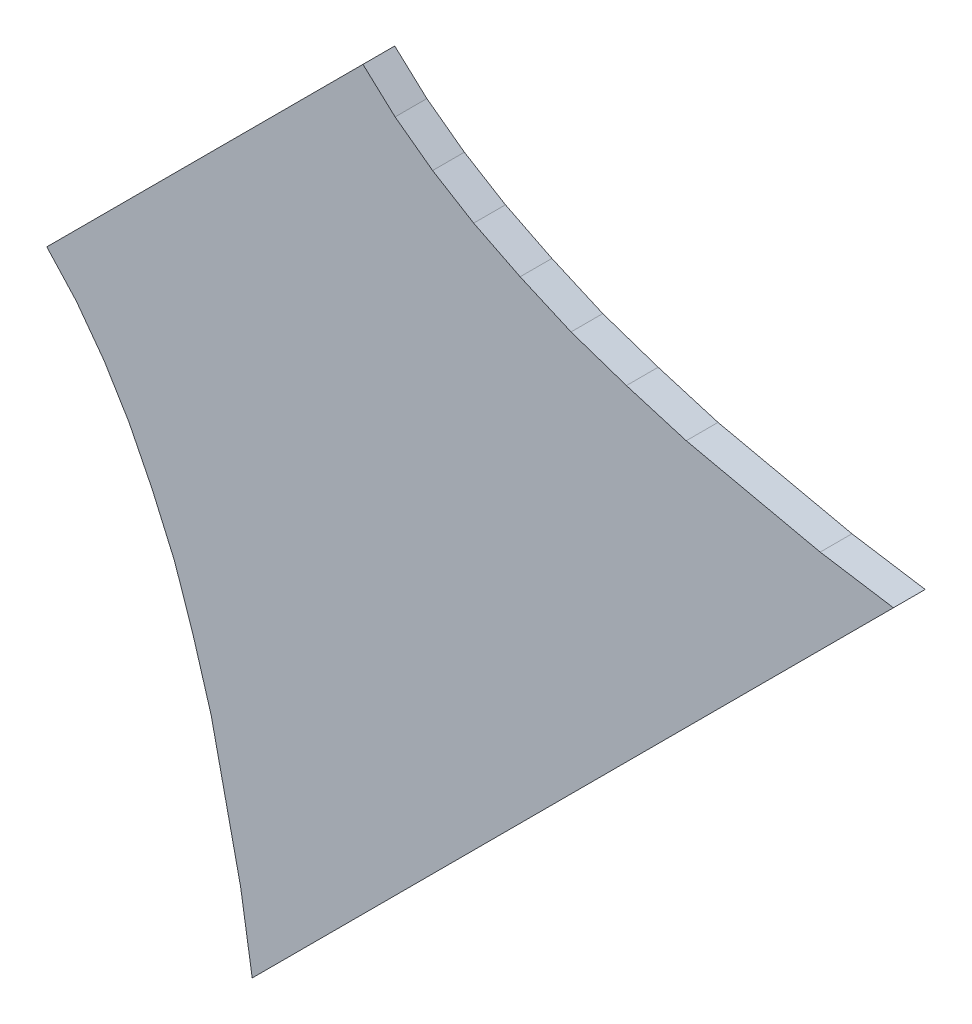
ISO-10303-21;
HEADER;
FILE_DESCRIPTION(('STEP AP214'),'2;1');
FILE_NAME('part.step','',(''),(''),'','','');
FILE_SCHEMA(('AUTOMOTIVE_DESIGN { 1 0 10303 214 1 1 1 1 }'));
ENDSEC;
DATA;
#1=APPLICATION_CONTEXT('core data for automotive mechanical design processes');
#2=APPLICATION_PROTOCOL_DEFINITION('international standard','automotive_design',2000,#1);
#3=PRODUCT_CONTEXT('',#1,'mechanical');
#4=PRODUCT('Part','Part','',(#3));
#5=PRODUCT_RELATED_PRODUCT_CATEGORY('part','',(#4));
#6=PRODUCT_DEFINITION_FORMATION('','',#4);
#7=PRODUCT_DEFINITION_CONTEXT('part definition',#1,'design');
#8=PRODUCT_DEFINITION('design','',#6,#7);
#9=PRODUCT_DEFINITION_SHAPE('','',#8);
#10=(LENGTH_UNIT() NAMED_UNIT(*) SI_UNIT(.MILLI.,.METRE.));
#11=(NAMED_UNIT(*) PLANE_ANGLE_UNIT() SI_UNIT($,.RADIAN.));
#12=(NAMED_UNIT(*) SI_UNIT($,.STERADIAN.) SOLID_ANGLE_UNIT());
#13=UNCERTAINTY_MEASURE_WITH_UNIT(LENGTH_MEASURE(1.E-05),#10,'distance_accuracy_value','');
#14=(GEOMETRIC_REPRESENTATION_CONTEXT(3) GLOBAL_UNCERTAINTY_ASSIGNED_CONTEXT((#13)) GLOBAL_UNIT_ASSIGNED_CONTEXT((#10,
#11,#12)) REPRESENTATION_CONTEXT('',''));
#15=CARTESIAN_POINT('',(0.,0.,0.));
#16=DIRECTION('',(0.,0.,1.));
#17=DIRECTION('',(1.,0.,0.));
#18=AXIS2_PLACEMENT_3D('',#15,#16,#17);
#19=CARTESIAN_POINT('',(98.0410003662109,93.504997253418,0.));
#20=DIRECTION('',(0.737141169182066,0.675738778446892,0.));
#21=DIRECTION('',(0.675738778446892,-0.737141169182066,0.));
#22=AXIS2_PLACEMENT_3D('',#19,#20,#21);
#23=PLANE('',#22);
#24=DIRECTION('',(0.675738778446892,-0.737141169182066,0.));
#25=VECTOR('',#24,1.);
#26=CARTESIAN_POINT('',(98.0410003662109,93.504997253418,0.03556));
#27=LINE('',#26,#25);
#28=CARTESIAN_POINT('',(98.0410003662109,93.504997253418,0.03556));
#29=VERTEX_POINT('',#28);
#30=CARTESIAN_POINT('',(98.0739974975586,93.4690017700195,0.03556));
#31=VERTEX_POINT('',#30);
#32=EDGE_CURVE('E11',#29,#31,#27,.T.);
#33=ORIENTED_EDGE('',*,*,#32,.F.);
#34=DIRECTION('',(0.,0.,1.));
#35=VECTOR('',#34,1.);
#36=CARTESIAN_POINT('',(98.0410003662109,93.504997253418,0.));
#37=LINE('',#36,#35);
#38=CARTESIAN_POINT('',(98.0410003662109,93.504997253418,0.));
#39=VERTEX_POINT('',#38);
#40=EDGE_CURVE('E24',#39,#29,#37,.T.);
#41=ORIENTED_EDGE('',*,*,#40,.F.);
#42=DIRECTION('',(0.675738778446892,-0.737141169182066,0.));
#43=VECTOR('',#42,1.);
#44=CARTESIAN_POINT('',(98.0410003662109,93.504997253418,0.));
#45=LINE('',#44,#43);
#46=CARTESIAN_POINT('',(98.0739974975586,93.4690017700195,0.));
#47=VERTEX_POINT('',#46);
#48=EDGE_CURVE('E172',#39,#47,#45,.T.);
#49=ORIENTED_EDGE('',*,*,#48,.T.);
#50=DIRECTION('',(0.,0.,1.));
#51=VECTOR('',#50,1.);
#52=CARTESIAN_POINT('',(98.0739974975586,93.4690017700195,0.));
#53=LINE('',#52,#51);
#54=EDGE_CURVE('E37',#47,#31,#53,.T.);
#55=ORIENTED_EDGE('',*,*,#54,.T.);
#56=EDGE_LOOP('',(#33,#41,#49,#55));
#57=FACE_BOUND('',#56,.T.);
#58=ADVANCED_FACE('F17',(#57),#23,.F.);
#59=CARTESIAN_POINT('',(98.0739974975586,93.4690017700195,0.));
#60=DIRECTION('',(0.804519212056665,0.59392662630305,0.));
#61=DIRECTION('',(0.59392662630305,-0.804519212056665,0.));
#62=AXIS2_PLACEMENT_3D('',#59,#60,#61);
#63=PLANE('',#62);
#64=DIRECTION('',(0.59392662630305,-0.804519212056665,0.));
#65=VECTOR('',#64,1.);
#66=CARTESIAN_POINT('',(98.0739974975586,93.4690017700195,0.03556));
#67=LINE('',#66,#65);
#68=CARTESIAN_POINT('',(98.1050033569336,93.427001953125,0.03556));
#69=VERTEX_POINT('',#68);
#70=EDGE_CURVE('E308',#31,#69,#67,.T.);
#71=ORIENTED_EDGE('',*,*,#70,.F.);
#72=ORIENTED_EDGE('',*,*,#54,.F.);
#73=DIRECTION('',(0.59392662630305,-0.804519212056665,0.));
#74=VECTOR('',#73,1.);
#75=CARTESIAN_POINT('',(98.0739974975586,93.4690017700195,0.));
#76=LINE('',#75,#74);
#77=CARTESIAN_POINT('',(98.1050033569336,93.427001953125,0.));
#78=VERTEX_POINT('',#77);
#79=EDGE_CURVE('E305',#47,#78,#76,.T.);
#80=ORIENTED_EDGE('',*,*,#79,.T.);
#81=DIRECTION('',(0.,0.,1.));
#82=VECTOR('',#81,1.);
#83=CARTESIAN_POINT('',(98.1050033569336,93.427001953125,0.));
#84=LINE('',#83,#82);
#85=EDGE_CURVE('E303',#78,#69,#84,.T.);
#86=ORIENTED_EDGE('',*,*,#85,.T.);
#87=EDGE_LOOP('',(#71,#72,#80,#86));
#88=FACE_BOUND('',#87,.T.);
#89=ADVANCED_FACE('F316',(#88),#63,.F.);
#90=CARTESIAN_POINT('',(98.1050033569336,93.427001953125,0.));
#91=DIRECTION('',(0.854225909982595,0.51990200491478,0.));
#92=DIRECTION('',(0.51990200491478,-0.854225909982595,0.));
#93=AXIS2_PLACEMENT_3D('',#90,#91,#92);
#94=PLANE('',#93);
#95=DIRECTION('',(0.51990200491478,-0.854225909982595,0.));
#96=VECTOR('',#95,1.);
#97=CARTESIAN_POINT('',(98.1050033569336,93.427001953125,0.03556));
#98=LINE('',#97,#96);
#99=CARTESIAN_POINT('',(98.1330032348633,93.3809967041016,0.03556));
#100=VERTEX_POINT('',#99);
#101=EDGE_CURVE('E300',#69,#100,#98,.T.);
#102=ORIENTED_EDGE('',*,*,#101,.F.);
#103=ORIENTED_EDGE('',*,*,#85,.F.);
#104=DIRECTION('',(0.51990200491478,-0.854225909982595,0.));
#105=VECTOR('',#104,1.);
#106=CARTESIAN_POINT('',(98.1050033569336,93.427001953125,0.));
#107=LINE('',#106,#105);
#108=CARTESIAN_POINT('',(98.1330032348633,93.3809967041016,0.));
#109=VERTEX_POINT('',#108);
#110=EDGE_CURVE('E297',#78,#109,#107,.T.);
#111=ORIENTED_EDGE('',*,*,#110,.T.);
#112=DIRECTION('',(0.,0.,1.));
#113=VECTOR('',#112,1.);
#114=CARTESIAN_POINT('',(98.1330032348633,93.3809967041016,0.));
#115=LINE('',#114,#113);
#116=EDGE_CURVE('E295',#109,#100,#115,.T.);
#117=ORIENTED_EDGE('',*,*,#116,.T.);
#118=EDGE_LOOP('',(#102,#103,#111,#117));
#119=FACE_BOUND('',#118,.T.);
#120=ADVANCED_FACE('F322',(#119),#94,.F.);
#121=CARTESIAN_POINT('',(98.1330032348633,93.3809967041016,0.));
#122=DIRECTION('',(0.894453439009846,0.447161095628253,0.));
#123=DIRECTION('',(0.447161095628253,-0.894453439009846,0.));
#124=AXIS2_PLACEMENT_3D('',#121,#122,#123);
#125=PLANE('',#124);
#126=DIRECTION('',(0.447161095628253,-0.894453439009846,0.));
#127=VECTOR('',#126,1.);
#128=CARTESIAN_POINT('',(98.1330032348633,93.3809967041016,0.03556));
#129=LINE('',#128,#127);
#130=CARTESIAN_POINT('',(98.1589965820312,93.3290023803711,0.03556));
#131=VERTEX_POINT('',#130);
#132=EDGE_CURVE('E292',#100,#131,#129,.T.);
#133=ORIENTED_EDGE('',*,*,#132,.F.);
#134=ORIENTED_EDGE('',*,*,#116,.F.);
#135=DIRECTION('',(0.447161095628253,-0.894453439009846,0.));
#136=VECTOR('',#135,1.);
#137=CARTESIAN_POINT('',(98.1330032348633,93.3809967041016,0.));
#138=LINE('',#137,#136);
#139=CARTESIAN_POINT('',(98.1589965820312,93.3290023803711,0.));
#140=VERTEX_POINT('',#139);
#141=EDGE_CURVE('E289',#109,#140,#138,.T.);
#142=ORIENTED_EDGE('',*,*,#141,.T.);
#143=DIRECTION('',(0.,0.,1.));
#144=VECTOR('',#143,1.);
#145=CARTESIAN_POINT('',(98.1589965820312,93.3290023803711,0.));
#146=LINE('',#145,#144);
#147=EDGE_CURVE('E287',#140,#131,#146,.T.);
#148=ORIENTED_EDGE('',*,*,#147,.T.);
#149=EDGE_LOOP('',(#133,#134,#142,#148));
#150=FACE_BOUND('',#149,.T.);
#151=ADVANCED_FACE('F324',(#150),#125,.F.);
#152=CARTESIAN_POINT('',(98.1589965820312,93.3290023803711,0.));
#153=DIRECTION('',(0.915777134064196,0.401686744522604,0.));
#154=DIRECTION('',(0.401686744522604,-0.915777134064196,0.));
#155=AXIS2_PLACEMENT_3D('',#152,#153,#154);
#156=PLANE('',#155);
#157=DIRECTION('',(0.401686744522604,-0.915777134064196,0.));
#158=VECTOR('',#157,1.);
#159=CARTESIAN_POINT('',(98.1589965820312,93.3290023803711,0.03556));
#160=LINE('',#159,#158);
#161=CARTESIAN_POINT('',(98.1839981079102,93.2720031738281,0.03556));
#162=VERTEX_POINT('',#161);
#163=EDGE_CURVE('E284',#131,#162,#160,.T.);
#164=ORIENTED_EDGE('',*,*,#163,.F.);
#165=ORIENTED_EDGE('',*,*,#147,.F.);
#166=DIRECTION('',(0.401686744522604,-0.915777134064196,0.));
#167=VECTOR('',#166,1.);
#168=CARTESIAN_POINT('',(98.1589965820312,93.3290023803711,0.));
#169=LINE('',#168,#167);
#170=CARTESIAN_POINT('',(98.1839981079102,93.2720031738281,0.));
#171=VERTEX_POINT('',#170);
#172=EDGE_CURVE('E281',#140,#171,#169,.T.);
#173=ORIENTED_EDGE('',*,*,#172,.T.);
#174=DIRECTION('',(0.,0.,1.));
#175=VECTOR('',#174,1.);
#176=CARTESIAN_POINT('',(98.1839981079102,93.2720031738281,0.));
#177=LINE('',#176,#175);
#178=EDGE_CURVE('E279',#171,#162,#177,.T.);
#179=ORIENTED_EDGE('',*,*,#178,.T.);
#180=EDGE_LOOP('',(#164,#165,#173,#179));
#181=FACE_BOUND('',#180,.T.);
#182=ADVANCED_FACE('F329',(#181),#156,.F.);
#183=CARTESIAN_POINT('',(98.1839981079102,93.2720031738281,0.));
#184=DIRECTION('',(0.947133723252728,0.320839072242495,0.));
#185=DIRECTION('',(0.320839072242495,-0.947133723252728,0.));
#186=AXIS2_PLACEMENT_3D('',#183,#184,#185);
#187=PLANE('',#186);
#188=DIRECTION('',(0.320839072242495,-0.947133723252728,0.));
#189=VECTOR('',#188,1.);
#190=CARTESIAN_POINT('',(98.1839981079102,93.2720031738281,0.03556));
#191=LINE('',#190,#189);
#192=CARTESIAN_POINT('',(98.2050018310547,93.2099990844727,0.03556));
#193=VERTEX_POINT('',#192);
#194=EDGE_CURVE('E276',#162,#193,#191,.T.);
#195=ORIENTED_EDGE('',*,*,#194,.F.);
#196=ORIENTED_EDGE('',*,*,#178,.F.);
#197=DIRECTION('',(0.320839072242495,-0.947133723252728,0.));
#198=VECTOR('',#197,1.);
#199=CARTESIAN_POINT('',(98.1839981079102,93.2720031738281,0.));
#200=LINE('',#199,#198);
#201=CARTESIAN_POINT('',(98.2050018310547,93.2099990844727,0.));
#202=VERTEX_POINT('',#201);
#203=EDGE_CURVE('E273',#171,#202,#200,.T.);
#204=ORIENTED_EDGE('',*,*,#203,.T.);
#205=DIRECTION('',(0.,0.,1.));
#206=VECTOR('',#205,1.);
#207=CARTESIAN_POINT('',(98.2050018310547,93.2099990844727,0.));
#208=LINE('',#207,#206);
#209=EDGE_CURVE('E271',#202,#193,#208,.T.);
#210=ORIENTED_EDGE('',*,*,#209,.T.);
#211=EDGE_LOOP('',(#195,#196,#204,#210));
#212=FACE_BOUND('',#211,.T.);
#213=ADVANCED_FACE('F332',(#212),#187,.F.);
#214=CARTESIAN_POINT('',(98.2050018310547,93.2099990844727,0.));
#215=DIRECTION('',(0.958233742102819,0.285986180602538,0.));
#216=DIRECTION('',(0.285986180602538,-0.958233742102819,0.));
#217=AXIS2_PLACEMENT_3D('',#214,#215,#216);
#218=PLANE('',#217);
#219=DIRECTION('',(0.285986180602538,-0.958233742102819,0.));
#220=VECTOR('',#219,1.);
#221=CARTESIAN_POINT('',(98.2050018310547,93.2099990844727,0.03556));
#222=LINE('',#221,#220);
#223=CARTESIAN_POINT('',(98.2249984741211,93.1429977416992,0.03556));
#224=VERTEX_POINT('',#223);
#225=EDGE_CURVE('E268',#193,#224,#222,.T.);
#226=ORIENTED_EDGE('',*,*,#225,.F.);
#227=ORIENTED_EDGE('',*,*,#209,.F.);
#228=DIRECTION('',(0.285986180602538,-0.958233742102819,0.));
#229=VECTOR('',#228,1.);
#230=CARTESIAN_POINT('',(98.2050018310547,93.2099990844727,0.));
#231=LINE('',#230,#229);
#232=CARTESIAN_POINT('',(98.2249984741211,93.1429977416992,0.));
#233=VERTEX_POINT('',#232);
#234=EDGE_CURVE('E265',#202,#233,#231,.T.);
#235=ORIENTED_EDGE('',*,*,#234,.T.);
#236=DIRECTION('',(0.,0.,1.));
#237=VECTOR('',#236,1.);
#238=CARTESIAN_POINT('',(98.2249984741211,93.1429977416992,0.));
#239=LINE('',#238,#237);
#240=EDGE_CURVE('E263',#233,#224,#239,.T.);
#241=ORIENTED_EDGE('',*,*,#240,.T.);
#242=EDGE_LOOP('',(#226,#227,#235,#241));
#243=FACE_BOUND('',#242,.T.);
#244=ADVANCED_FACE('F337',(#243),#218,.F.);
#245=CARTESIAN_POINT('',(98.2249984741211,93.1429977416992,0.));
#246=DIRECTION('',(0.976638420545082,0.214889263378161,0.));
#247=DIRECTION('',(0.214889263378161,-0.976638420545082,0.));
#248=AXIS2_PLACEMENT_3D('',#245,#246,#247);
#249=PLANE('',#248);
#250=DIRECTION('',(0.214889263378161,-0.976638420545081,0.));
#251=VECTOR('',#250,1.);
#252=CARTESIAN_POINT('',(98.2249984741211,93.1429977416992,0.03556));
#253=LINE('',#252,#251);
#254=CARTESIAN_POINT('',(98.2580032348633,92.9929962158203,0.03556));
#255=VERTEX_POINT('',#254);
#256=EDGE_CURVE('E260',#224,#255,#253,.T.);
#257=ORIENTED_EDGE('',*,*,#256,.F.);
#258=ORIENTED_EDGE('',*,*,#240,.F.);
#259=DIRECTION('',(0.214889263378161,-0.976638420545081,0.));
#260=VECTOR('',#259,1.);
#261=CARTESIAN_POINT('',(98.2249984741211,93.1429977416992,0.));
#262=LINE('',#261,#260);
#263=CARTESIAN_POINT('',(98.2580032348633,92.9929962158203,0.));
#264=VERTEX_POINT('',#263);
#265=EDGE_CURVE('E257',#233,#264,#262,.T.);
#266=ORIENTED_EDGE('',*,*,#265,.T.);
#267=DIRECTION('',(0.,0.,1.));
#268=VECTOR('',#267,1.);
#269=CARTESIAN_POINT('',(98.2580032348633,92.9929962158203,0.));
#270=LINE('',#269,#268);
#271=EDGE_CURVE('E255',#264,#255,#270,.T.);
#272=ORIENTED_EDGE('',*,*,#271,.T.);
#273=EDGE_LOOP('',(#257,#258,#266,#272));
#274=FACE_BOUND('',#273,.T.);
#275=ADVANCED_FACE('F340',(#274),#249,.F.);
#276=CARTESIAN_POINT('',(98.2580032348633,92.9929962158203,0.));
#277=DIRECTION('',(0.98766216531375,0.156599639871092,0.));
#278=DIRECTION('',(0.156599639871092,-0.98766216531375,0.));
#279=AXIS2_PLACEMENT_3D('',#276,#277,#278);
#280=PLANE('',#279);
#281=DIRECTION('',(0.156599639871092,-0.98766216531375,0.));
#282=VECTOR('',#281,1.);
#283=CARTESIAN_POINT('',(98.2580032348633,92.9929962158203,0.03556));
#284=LINE('',#283,#282);
#285=CARTESIAN_POINT('',(98.2710037231445,92.911003112793,0.03556));
#286=VERTEX_POINT('',#285);
#287=EDGE_CURVE('E252',#255,#286,#284,.T.);
#288=ORIENTED_EDGE('',*,*,#287,.F.);
#289=ORIENTED_EDGE('',*,*,#271,.F.);
#290=DIRECTION('',(0.156599639871092,-0.98766216531375,0.));
#291=VECTOR('',#290,1.);
#292=CARTESIAN_POINT('',(98.2580032348633,92.9929962158203,0.));
#293=LINE('',#292,#291);
#294=CARTESIAN_POINT('',(98.2710037231445,92.911003112793,0.));
#295=VERTEX_POINT('',#294);
#296=EDGE_CURVE('E249',#264,#295,#293,.T.);
#297=ORIENTED_EDGE('',*,*,#296,.T.);
#298=DIRECTION('',(0.,0.,1.));
#299=VECTOR('',#298,1.);
#300=CARTESIAN_POINT('',(98.2710037231445,92.911003112793,0.));
#301=LINE('',#300,#299);
#302=EDGE_CURVE('E247',#295,#286,#301,.T.);
#303=ORIENTED_EDGE('',*,*,#302,.T.);
#304=EDGE_LOOP('',(#288,#289,#297,#303));
#305=FACE_BOUND('',#304,.T.);
#306=ADVANCED_FACE('F345',(#305),#280,.F.);
#307=CARTESIAN_POINT('',(98.2710037231445,92.911003112793,0.));
#308=DIRECTION('',(-0.707106781186548,0.707106781186548,0.));
#309=DIRECTION('',(0.707106781186548,0.707106781186548,0.));
#310=AXIS2_PLACEMENT_3D('',#307,#308,#309);
#311=PLANE('',#310);
#312=DIRECTION('',(0.707106781186548,0.707106781186548,0.));
#313=VECTOR('',#312,1.);
#314=CARTESIAN_POINT('',(98.2710037231445,92.911003112793,0.03556));
#315=LINE('',#314,#313);
#316=CARTESIAN_POINT('',(98.9889984130859,93.6289978027344,0.03556));
#317=VERTEX_POINT('',#316);
#318=EDGE_CURVE('E244',#286,#317,#315,.T.);
#319=ORIENTED_EDGE('',*,*,#318,.F.);
#320=ORIENTED_EDGE('',*,*,#302,.F.);
#321=DIRECTION('',(0.707106781186548,0.707106781186548,0.));
#322=VECTOR('',#321,1.);
#323=CARTESIAN_POINT('',(98.2710037231445,92.911003112793,0.));
#324=LINE('',#323,#322);
#325=CARTESIAN_POINT('',(98.9889984130859,93.6289978027344,0.));
#326=VERTEX_POINT('',#325);
#327=EDGE_CURVE('E241',#295,#326,#324,.T.);
#328=ORIENTED_EDGE('',*,*,#327,.T.);
#329=DIRECTION('',(0.,0.,1.));
#330=VECTOR('',#329,1.);
#331=CARTESIAN_POINT('',(98.9889984130859,93.6289978027344,0.));
#332=LINE('',#331,#330);
#333=EDGE_CURVE('E239',#326,#317,#332,.T.);
#334=ORIENTED_EDGE('',*,*,#333,.T.);
#335=EDGE_LOOP('',(#319,#320,#328,#334));
#336=FACE_BOUND('',#335,.T.);
#337=ADVANCED_FACE('F348',(#336),#311,.F.);
#338=CARTESIAN_POINT('',(98.9889984130859,93.6289978027344,0.));
#339=DIRECTION('',(-0.156585427012916,-0.987664418741094,0.));
#340=DIRECTION('',(-0.987664418741094,0.156585427012916,0.));
#341=AXIS2_PLACEMENT_3D('',#338,#339,#340);
#342=PLANE('',#341);
#343=DIRECTION('',(-0.987664418741094,0.156585427012916,0.));
#344=VECTOR('',#343,1.);
#345=CARTESIAN_POINT('',(98.9889984130859,93.6289978027344,0.03556));
#346=LINE('',#345,#344);
#347=CARTESIAN_POINT('',(98.9069976806641,93.6419982910156,0.03556));
#348=VERTEX_POINT('',#347);
#349=EDGE_CURVE('E236',#317,#348,#346,.T.);
#350=ORIENTED_EDGE('',*,*,#349,.F.);
#351=ORIENTED_EDGE('',*,*,#333,.F.);
#352=DIRECTION('',(-0.987664418741094,0.156585427012916,0.));
#353=VECTOR('',#352,1.);
#354=CARTESIAN_POINT('',(98.9889984130859,93.6289978027344,0.));
#355=LINE('',#354,#353);
#356=CARTESIAN_POINT('',(98.9069976806641,93.6419982910156,0.));
#357=VERTEX_POINT('',#356);
#358=EDGE_CURVE('E233',#326,#357,#355,.T.);
#359=ORIENTED_EDGE('',*,*,#358,.T.);
#360=DIRECTION('',(0.,0.,1.));
#361=VECTOR('',#360,1.);
#362=CARTESIAN_POINT('',(98.9069976806641,93.6419982910156,0.));
#363=LINE('',#362,#361);
#364=EDGE_CURVE('E231',#357,#348,#363,.T.);
#365=ORIENTED_EDGE('',*,*,#364,.T.);
#366=EDGE_LOOP('',(#350,#351,#359,#365));
#367=FACE_BOUND('',#366,.T.);
#368=ADVANCED_FACE('F353',(#367),#342,.F.);
#369=CARTESIAN_POINT('',(98.9069976806641,93.6419982910156,0.));
#370=DIRECTION('',(-0.214899688887557,-0.976636126567122,0.));
#371=DIRECTION('',(-0.976636126567122,0.214899688887557,0.));
#372=AXIS2_PLACEMENT_3D('',#369,#370,#371);
#373=PLANE('',#372);
#374=DIRECTION('',(-0.976636126567122,0.214899688887557,0.));
#375=VECTOR('',#374,1.);
#376=CARTESIAN_POINT('',(98.9069976806641,93.6419982910156,0.03556));
#377=LINE('',#376,#375);
#378=CARTESIAN_POINT('',(98.7570037841797,93.6750030517578,0.03556));
#379=VERTEX_POINT('',#378);
#380=EDGE_CURVE('E228',#348,#379,#377,.T.);
#381=ORIENTED_EDGE('',*,*,#380,.F.);
#382=ORIENTED_EDGE('',*,*,#364,.F.);
#383=DIRECTION('',(-0.976636126567122,0.214899688887557,0.));
#384=VECTOR('',#383,1.);
#385=CARTESIAN_POINT('',(98.9069976806641,93.6419982910156,0.));
#386=LINE('',#385,#384);
#387=CARTESIAN_POINT('',(98.7570037841797,93.6750030517578,0.));
#388=VERTEX_POINT('',#387);
#389=EDGE_CURVE('E225',#357,#388,#386,.T.);
#390=ORIENTED_EDGE('',*,*,#389,.T.);
#391=DIRECTION('',(0.,0.,1.));
#392=VECTOR('',#391,1.);
#393=CARTESIAN_POINT('',(98.7570037841797,93.6750030517578,0.));
#394=LINE('',#393,#392);
#395=EDGE_CURVE('E223',#388,#379,#394,.T.);
#396=ORIENTED_EDGE('',*,*,#395,.T.);
#397=EDGE_LOOP('',(#381,#382,#390,#396));
#398=FACE_BOUND('',#397,.T.);
#399=ADVANCED_FACE('F356',(#398),#373,.F.);
#400=CARTESIAN_POINT('',(98.7570037841797,93.6750030517578,0.));
#401=DIRECTION('',(-0.285986180602538,-0.958233742102819,0.));
#402=DIRECTION('',(-0.958233742102819,0.285986180602538,0.));
#403=AXIS2_PLACEMENT_3D('',#400,#401,#402);
#404=PLANE('',#403);
#405=DIRECTION('',(-0.958233742102819,0.285986180602538,0.));
#406=VECTOR('',#405,1.);
#407=CARTESIAN_POINT('',(98.7570037841797,93.6750030517578,0.03556));
#408=LINE('',#407,#406);
#409=CARTESIAN_POINT('',(98.6900024414062,93.6949996948242,0.03556));
#410=VERTEX_POINT('',#409);
#411=EDGE_CURVE('E220',#379,#410,#408,.T.);
#412=ORIENTED_EDGE('',*,*,#411,.F.);
#413=ORIENTED_EDGE('',*,*,#395,.F.);
#414=DIRECTION('',(-0.958233742102819,0.285986180602538,0.));
#415=VECTOR('',#414,1.);
#416=CARTESIAN_POINT('',(98.7570037841797,93.6750030517578,0.));
#417=LINE('',#416,#415);
#418=CARTESIAN_POINT('',(98.6900024414062,93.6949996948242,0.));
#419=VERTEX_POINT('',#418);
#420=EDGE_CURVE('E217',#388,#419,#417,.T.);
#421=ORIENTED_EDGE('',*,*,#420,.T.);
#422=DIRECTION('',(0.,0.,1.));
#423=VECTOR('',#422,1.);
#424=CARTESIAN_POINT('',(98.6900024414062,93.6949996948242,0.));
#425=LINE('',#424,#423);
#426=EDGE_CURVE('E215',#419,#410,#425,.T.);
#427=ORIENTED_EDGE('',*,*,#426,.T.);
#428=EDGE_LOOP('',(#412,#413,#421,#427));
#429=FACE_BOUND('',#428,.T.);
#430=ADVANCED_FACE('F361',(#429),#404,.F.);
#431=CARTESIAN_POINT('',(98.6900024414063,93.6949996948242,0.));
#432=DIRECTION('',(-0.320839072242495,-0.947133723252728,0.));
#433=DIRECTION('',(-0.947133723252728,0.320839072242495,0.));
#434=AXIS2_PLACEMENT_3D('',#431,#432,#433);
#435=PLANE('',#434);
#436=DIRECTION('',(-0.947133723252728,0.320839072242495,0.));
#437=VECTOR('',#436,1.);
#438=CARTESIAN_POINT('',(98.6900024414062,93.6949996948242,0.03556));
#439=LINE('',#438,#437);
#440=CARTESIAN_POINT('',(98.6279983520508,93.7160034179688,0.03556));
#441=VERTEX_POINT('',#440);
#442=EDGE_CURVE('E212',#410,#441,#439,.T.);
#443=ORIENTED_EDGE('',*,*,#442,.F.);
#444=ORIENTED_EDGE('',*,*,#426,.F.);
#445=DIRECTION('',(-0.947133723252728,0.320839072242495,0.));
#446=VECTOR('',#445,1.);
#447=CARTESIAN_POINT('',(98.6900024414062,93.6949996948242,0.));
#448=LINE('',#447,#446);
#449=CARTESIAN_POINT('',(98.6279983520508,93.7160034179688,0.));
#450=VERTEX_POINT('',#449);
#451=EDGE_CURVE('E209',#419,#450,#448,.T.);
#452=ORIENTED_EDGE('',*,*,#451,.T.);
#453=DIRECTION('',(0.,0.,1.));
#454=VECTOR('',#453,1.);
#455=CARTESIAN_POINT('',(98.6279983520508,93.7160034179688,0.));
#456=LINE('',#455,#454);
#457=EDGE_CURVE('E207',#450,#441,#456,.T.);
#458=ORIENTED_EDGE('',*,*,#457,.T.);
#459=EDGE_LOOP('',(#443,#444,#452,#458));
#460=FACE_BOUND('',#459,.T.);
#461=ADVANCED_FACE('F364',(#460),#435,.F.);
#462=CARTESIAN_POINT('',(98.6279983520508,93.7160034179688,0.));
#463=DIRECTION('',(-0.401583937513721,-0.91582222135684,0.));
#464=DIRECTION('',(-0.91582222135684,0.401583937513721,0.));
#465=AXIS2_PLACEMENT_3D('',#462,#463,#464);
#466=PLANE('',#465);
#467=DIRECTION('',(-0.91582222135684,0.401583937513721,0.));
#468=VECTOR('',#467,1.);
#469=CARTESIAN_POINT('',(98.6279983520508,93.7160034179688,0.03556));
#470=LINE('',#469,#468);
#471=CARTESIAN_POINT('',(98.5709991455078,93.7409973144531,0.03556));
#472=VERTEX_POINT('',#471);
#473=EDGE_CURVE('E204',#441,#472,#470,.T.);
#474=ORIENTED_EDGE('',*,*,#473,.F.);
#475=ORIENTED_EDGE('',*,*,#457,.F.);
#476=DIRECTION('',(-0.91582222135684,0.401583937513721,0.));
#477=VECTOR('',#476,1.);
#478=CARTESIAN_POINT('',(98.6279983520508,93.7160034179688,0.));
#479=LINE('',#478,#477);
#480=CARTESIAN_POINT('',(98.5709991455078,93.7409973144531,0.));
#481=VERTEX_POINT('',#480);
#482=EDGE_CURVE('E201',#450,#481,#479,.T.);
#483=ORIENTED_EDGE('',*,*,#482,.T.);
#484=DIRECTION('',(0.,0.,1.));
#485=VECTOR('',#484,1.);
#486=CARTESIAN_POINT('',(98.5709991455078,93.7409973144531,0.));
#487=LINE('',#486,#485);
#488=EDGE_CURVE('E199',#481,#472,#487,.T.);
#489=ORIENTED_EDGE('',*,*,#488,.T.);
#490=EDGE_LOOP('',(#474,#475,#483,#489));
#491=FACE_BOUND('',#490,.T.);
#492=ADVANCED_FACE('F369',(#491),#466,.F.);
#493=CARTESIAN_POINT('',(98.5709991455078,93.7409973144531,0.));
#494=DIRECTION('',(-0.447213595499958,-0.894427190999916,0.));
#495=DIRECTION('',(-0.894427190999916,0.447213595499958,0.));
#496=AXIS2_PLACEMENT_3D('',#493,#494,#495);
#497=PLANE('',#496);
#498=DIRECTION('',(-0.894427190999916,0.447213595499958,0.));
#499=VECTOR('',#498,1.);
#500=CARTESIAN_POINT('',(98.5709991455078,93.7409973144531,0.03556));
#501=LINE('',#500,#499);
#502=CARTESIAN_POINT('',(98.5189971923828,93.7669982910156,0.03556));
#503=VERTEX_POINT('',#502);
#504=EDGE_CURVE('E196',#472,#503,#501,.T.);
#505=ORIENTED_EDGE('',*,*,#504,.F.);
#506=ORIENTED_EDGE('',*,*,#488,.F.);
#507=DIRECTION('',(-0.894427190999916,0.447213595499958,0.));
#508=VECTOR('',#507,1.);
#509=CARTESIAN_POINT('',(98.5709991455078,93.7409973144531,0.));
#510=LINE('',#509,#508);
#511=CARTESIAN_POINT('',(98.5189971923828,93.7669982910156,0.));
#512=VERTEX_POINT('',#511);
#513=EDGE_CURVE('E193',#481,#512,#510,.T.);
#514=ORIENTED_EDGE('',*,*,#513,.T.);
#515=DIRECTION('',(0.,0.,1.));
#516=VECTOR('',#515,1.);
#517=CARTESIAN_POINT('',(98.5189971923828,93.7669982910156,0.));
#518=LINE('',#517,#516);
#519=EDGE_CURVE('E191',#512,#503,#518,.T.);
#520=ORIENTED_EDGE('',*,*,#519,.T.);
#521=EDGE_LOOP('',(#505,#506,#514,#520));
#522=FACE_BOUND('',#521,.T.);
#523=ADVANCED_FACE('F372',(#522),#497,.F.);
#524=CARTESIAN_POINT('',(98.5189971923828,93.7669982910156,0.));
#525=DIRECTION('',(-0.519964925460703,-0.854187611880812,0.));
#526=DIRECTION('',(-0.854187611880812,0.519964925460703,0.));
#527=AXIS2_PLACEMENT_3D('',#524,#525,#526);
#528=PLANE('',#527);
#529=DIRECTION('',(-0.854187611880812,0.519964925460703,0.));
#530=VECTOR('',#529,1.);
#531=CARTESIAN_POINT('',(98.5189971923828,93.7669982910156,0.03556));
#532=LINE('',#531,#530);
#533=CARTESIAN_POINT('',(98.4729995727539,93.7949981689453,0.03556));
#534=VERTEX_POINT('',#533);
#535=EDGE_CURVE('E188',#503,#534,#532,.T.);
#536=ORIENTED_EDGE('',*,*,#535,.F.);
#537=ORIENTED_EDGE('',*,*,#519,.F.);
#538=DIRECTION('',(-0.854187611880812,0.519964925460703,0.));
#539=VECTOR('',#538,1.);
#540=CARTESIAN_POINT('',(98.5189971923828,93.7669982910156,0.));
#541=LINE('',#540,#539);
#542=CARTESIAN_POINT('',(98.4729995727539,93.7949981689453,0.));
#543=VERTEX_POINT('',#542);
#544=EDGE_CURVE('E185',#512,#543,#541,.T.);
#545=ORIENTED_EDGE('',*,*,#544,.T.);
#546=DIRECTION('',(0.,0.,1.));
#547=VECTOR('',#546,1.);
#548=CARTESIAN_POINT('',(98.4729995727539,93.7949981689453,0.));
#549=LINE('',#548,#547);
#550=EDGE_CURVE('E183',#543,#534,#549,.T.);
#551=ORIENTED_EDGE('',*,*,#550,.T.);
#552=EDGE_LOOP('',(#536,#537,#545,#551));
#553=FACE_BOUND('',#552,.T.);
#554=ADVANCED_FACE('F377',(#553),#528,.F.);
#555=CARTESIAN_POINT('',(98.4729995727539,93.7949981689453,0.));
#556=DIRECTION('',(-0.593832022525237,-0.80458904356422,0.));
#557=DIRECTION('',(-0.80458904356422,0.593832022525237,0.));
#558=AXIS2_PLACEMENT_3D('',#555,#556,#557);
#559=PLANE('',#558);
#560=DIRECTION('',(-0.80458904356422,0.593832022525237,0.));
#561=VECTOR('',#560,1.);
#562=CARTESIAN_POINT('',(98.4729995727539,93.7949981689453,0.03556));
#563=LINE('',#562,#561);
#564=CARTESIAN_POINT('',(98.4309997558594,93.8259963989258,0.03556));
#565=VERTEX_POINT('',#564);
#566=EDGE_CURVE('E180',#534,#565,#563,.T.);
#567=ORIENTED_EDGE('',*,*,#566,.F.);
#568=ORIENTED_EDGE('',*,*,#550,.F.);
#569=DIRECTION('',(-0.80458904356422,0.593832022525237,0.));
#570=VECTOR('',#569,1.);
#571=CARTESIAN_POINT('',(98.4729995727539,93.7949981689453,0.));
#572=LINE('',#571,#570);
#573=CARTESIAN_POINT('',(98.4309997558594,93.8259963989258,0.));
#574=VERTEX_POINT('',#573);
#575=EDGE_CURVE('E178',#543,#574,#572,.T.);
#576=ORIENTED_EDGE('',*,*,#575,.T.);
#577=DIRECTION('',(0.,0.,1.));
#578=VECTOR('',#577,1.);
#579=CARTESIAN_POINT('',(98.4309997558594,93.8259963989258,0.));
#580=LINE('',#579,#578);
#581=EDGE_CURVE('E163',#574,#565,#580,.T.);
#582=ORIENTED_EDGE('',*,*,#581,.T.);
#583=EDGE_LOOP('',(#567,#568,#576,#582));
#584=FACE_BOUND('',#583,.T.);
#585=ADVANCED_FACE('F379',(#584),#559,.F.);
#586=CARTESIAN_POINT('',(98.4309997558594,93.8259963989258,0.));
#587=DIRECTION('',(-0.675745848634045,-0.737134687865016,0.));
#588=DIRECTION('',(-0.737134687865016,0.675745848634045,0.));
#589=AXIS2_PLACEMENT_3D('',#586,#587,#588);
#590=PLANE('',#589);
#591=DIRECTION('',(-0.737134687865016,0.675745848634045,0.));
#592=VECTOR('',#591,1.);
#593=CARTESIAN_POINT('',(98.4309997558594,93.8259963989258,0.03556));
#594=LINE('',#593,#592);
#595=CARTESIAN_POINT('',(98.3949966430664,93.859001159668,0.03556));
#596=VERTEX_POINT('',#595);
#597=EDGE_CURVE('E167',#565,#596,#594,.T.);
#598=ORIENTED_EDGE('',*,*,#597,.F.);
#599=ORIENTED_EDGE('',*,*,#581,.F.);
#600=DIRECTION('',(-0.737134687865016,0.675745848634045,0.));
#601=VECTOR('',#600,1.);
#602=CARTESIAN_POINT('',(98.4309997558594,93.8259963989258,0.));
#603=LINE('',#602,#601);
#604=CARTESIAN_POINT('',(98.3949966430664,93.859001159668,0.));
#605=VERTEX_POINT('',#604);
#606=EDGE_CURVE('E159',#574,#605,#603,.T.);
#607=ORIENTED_EDGE('',*,*,#606,.T.);
#608=DIRECTION('',(0.,0.,1.));
#609=VECTOR('',#608,1.);
#610=CARTESIAN_POINT('',(98.3949966430664,93.859001159668,0.));
#611=LINE('',#610,#609);
#612=EDGE_CURVE('E149',#605,#596,#611,.T.);
#613=ORIENTED_EDGE('',*,*,#612,.T.);
#614=EDGE_LOOP('',(#598,#599,#607,#613));
#615=FACE_BOUND('',#614,.T.);
#616=ADVANCED_FACE('F162',(#615),#590,.F.);
#617=CARTESIAN_POINT('',(98.3949966430664,93.859001159668,0.));
#618=DIRECTION('',(0.707114400912744,-0.707099161378241,0.));
#619=DIRECTION('',(-0.707099161378241,-0.707114400912744,0.));
#620=AXIS2_PLACEMENT_3D('',#617,#618,#619);
#621=PLANE('',#620);
#622=DIRECTION('',(-0.707099161378241,-0.707114400912744,0.));
#623=VECTOR('',#622,1.);
#624=CARTESIAN_POINT('',(98.3949966430664,93.859001159668,0.03556));
#625=LINE('',#624,#623);
#626=EDGE_CURVE('E155',#596,#29,#625,.T.);
#627=ORIENTED_EDGE('',*,*,#626,.F.);
#628=ORIENTED_EDGE('',*,*,#612,.F.);
#629=DIRECTION('',(-0.707099161378241,-0.707114400912744,0.));
#630=VECTOR('',#629,1.);
#631=CARTESIAN_POINT('',(98.3949966430664,93.859001159668,0.));
#632=LINE('',#631,#630);
#633=EDGE_CURVE('E153',#605,#39,#632,.T.);
#634=ORIENTED_EDGE('',*,*,#633,.T.);
#635=ORIENTED_EDGE('',*,*,#40,.T.);
#636=EDGE_LOOP('',(#627,#628,#634,#635));
#637=FACE_BOUND('',#636,.T.);
#638=ADVANCED_FACE('F151',(#637),#621,.F.);
#639=CARTESIAN_POINT('',(98.0410003662109,93.504997253418,0.));
#640=DIRECTION('',(0.,0.,1.));
#641=DIRECTION('',(1.,0.,0.));
#642=AXIS2_PLACEMENT_3D('',#639,#640,#641);
#643=PLANE('',#642);
#644=ORIENTED_EDGE('',*,*,#633,.F.);
#645=ORIENTED_EDGE('',*,*,#606,.F.);
#646=ORIENTED_EDGE('',*,*,#575,.F.);
#647=ORIENTED_EDGE('',*,*,#544,.F.);
#648=ORIENTED_EDGE('',*,*,#513,.F.);
#649=ORIENTED_EDGE('',*,*,#482,.F.);
#650=ORIENTED_EDGE('',*,*,#451,.F.);
#651=ORIENTED_EDGE('',*,*,#420,.F.);
#652=ORIENTED_EDGE('',*,*,#389,.F.);
#653=ORIENTED_EDGE('',*,*,#358,.F.);
#654=ORIENTED_EDGE('',*,*,#327,.F.);
#655=ORIENTED_EDGE('',*,*,#296,.F.);
#656=ORIENTED_EDGE('',*,*,#265,.F.);
#657=ORIENTED_EDGE('',*,*,#234,.F.);
#658=ORIENTED_EDGE('',*,*,#203,.F.);
#659=ORIENTED_EDGE('',*,*,#172,.F.);
#660=ORIENTED_EDGE('',*,*,#141,.F.);
#661=ORIENTED_EDGE('',*,*,#110,.F.);
#662=ORIENTED_EDGE('',*,*,#79,.F.);
#663=ORIENTED_EDGE('',*,*,#48,.F.);
#664=EDGE_LOOP('',(#644,#645,#646,#647,#648,#649,#650,#651,#652,#653,#654,#655,#656,#657,#658,
#659,#660,#661,#662,#663));
#665=FACE_BOUND('',#664,.T.);
#666=ADVANCED_FACE('F170',(#665),#643,.F.);
#667=CARTESIAN_POINT('',(98.0410003662109,93.504997253418,0.03556));
#668=DIRECTION('',(0.,0.,1.));
#669=DIRECTION('',(1.,0.,0.));
#670=AXIS2_PLACEMENT_3D('',#667,#668,#669);
#671=PLANE('',#670);
#672=ORIENTED_EDGE('',*,*,#32,.T.);
#673=ORIENTED_EDGE('',*,*,#70,.T.);
#674=ORIENTED_EDGE('',*,*,#101,.T.);
#675=ORIENTED_EDGE('',*,*,#132,.T.);
#676=ORIENTED_EDGE('',*,*,#163,.T.);
#677=ORIENTED_EDGE('',*,*,#194,.T.);
#678=ORIENTED_EDGE('',*,*,#225,.T.);
#679=ORIENTED_EDGE('',*,*,#256,.T.);
#680=ORIENTED_EDGE('',*,*,#287,.T.);
#681=ORIENTED_EDGE('',*,*,#318,.T.);
#682=ORIENTED_EDGE('',*,*,#349,.T.);
#683=ORIENTED_EDGE('',*,*,#380,.T.);
#684=ORIENTED_EDGE('',*,*,#411,.T.);
#685=ORIENTED_EDGE('',*,*,#442,.T.);
#686=ORIENTED_EDGE('',*,*,#473,.T.);
#687=ORIENTED_EDGE('',*,*,#504,.T.);
#688=ORIENTED_EDGE('',*,*,#535,.T.);
#689=ORIENTED_EDGE('',*,*,#566,.T.);
#690=ORIENTED_EDGE('',*,*,#597,.T.);
#691=ORIENTED_EDGE('',*,*,#626,.T.);
#692=EDGE_LOOP('',(#672,#673,#674,#675,#676,#677,#678,#679,#680,#681,#682,#683,#684,#685,#686,
#687,#688,#689,#690,#691));
#693=FACE_BOUND('',#692,.T.);
#694=ADVANCED_FACE('F319',(#693),#671,.T.);
#695=CLOSED_SHELL('',(#58,#89,#120,#151,#182,#213,#244,#275,#306,#337,#368,#399,#430,#461,#492,
#523,#554,#585,#616,#638,#666,#694));
#696=MANIFOLD_SOLID_BREP('B1',#695);
#697=ADVANCED_BREP_SHAPE_REPRESENTATION('',(#18,#696),#14);
#698=SHAPE_DEFINITION_REPRESENTATION(#9,#697);
ENDSEC;
END-ISO-10303-21;
